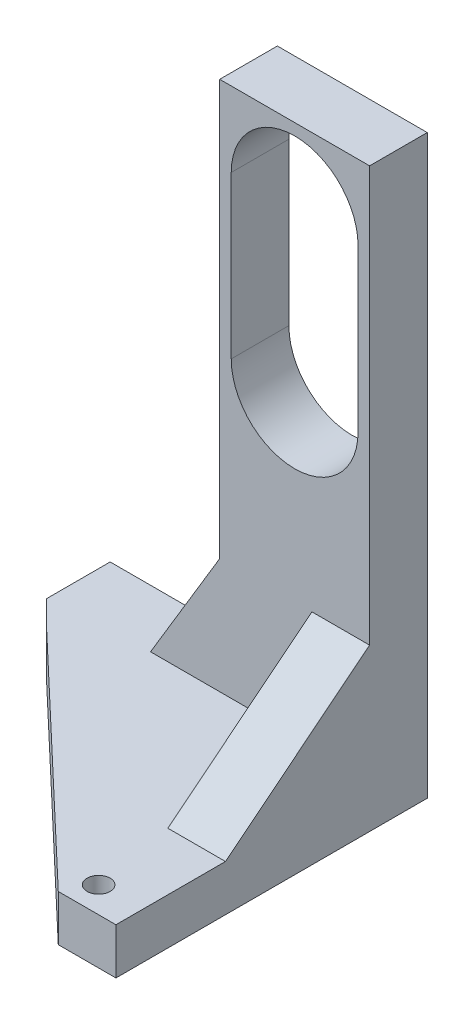
ISO-10303-21;
HEADER;
FILE_DESCRIPTION(('STEP AP214'),'2;1');
FILE_NAME('part.step','',(''),(''),'','','');
FILE_SCHEMA(('AUTOMOTIVE_DESIGN { 1 0 10303 214 1 1 1 1 }'));
ENDSEC;
DATA;
#1=APPLICATION_CONTEXT('core data for automotive mechanical design processes');
#2=APPLICATION_PROTOCOL_DEFINITION('international standard','automotive_design',2000,#1);
#3=PRODUCT_CONTEXT('',#1,'mechanical');
#4=PRODUCT('Part','Part','',(#3));
#5=PRODUCT_RELATED_PRODUCT_CATEGORY('part','',(#4));
#6=PRODUCT_DEFINITION_FORMATION('','',#4);
#7=PRODUCT_DEFINITION_CONTEXT('part definition',#1,'design');
#8=PRODUCT_DEFINITION('design','',#6,#7);
#9=PRODUCT_DEFINITION_SHAPE('','',#8);
#10=(LENGTH_UNIT() NAMED_UNIT(*) SI_UNIT(.MILLI.,.METRE.));
#11=(NAMED_UNIT(*) PLANE_ANGLE_UNIT() SI_UNIT($,.RADIAN.));
#12=(NAMED_UNIT(*) SI_UNIT($,.STERADIAN.) SOLID_ANGLE_UNIT());
#13=UNCERTAINTY_MEASURE_WITH_UNIT(LENGTH_MEASURE(1.E-05),#10,'distance_accuracy_value','');
#14=(GEOMETRIC_REPRESENTATION_CONTEXT(3) GLOBAL_UNCERTAINTY_ASSIGNED_CONTEXT((#13)) GLOBAL_UNIT_ASSIGNED_CONTEXT((#10,
#11,#12)) REPRESENTATION_CONTEXT('',''));
#15=CARTESIAN_POINT('',(0.,0.,0.));
#16=DIRECTION('',(0.,0.,1.));
#17=DIRECTION('',(1.,0.,0.));
#18=AXIS2_PLACEMENT_3D('',#15,#16,#17);
#19=CARTESIAN_POINT('',(0.,0.,10.));
#20=DIRECTION('',(0.,0.,-1.));
#21=DIRECTION('',(-1.,0.,0.));
#22=AXIS2_PLACEMENT_3D('',#19,#20,#21);
#23=PLANE('',#22);
#24=DIRECTION('',(0.,1.,0.));
#25=VECTOR('',#24,1.);
#26=CARTESIAN_POINT('',(3.00000000000022,-53.75,9.99999999999997));
#27=LINE('',#26,#25);
#28=CARTESIAN_POINT('',(3.00000000000022,-53.75,10.0000000000002));
#29=VERTEX_POINT('',#28);
#30=CARTESIAN_POINT('',(3.00000000000022,-33.75,10.));
#31=VERTEX_POINT('',#30);
#32=EDGE_CURVE('E196',#29,#31,#27,.T.);
#33=ORIENTED_EDGE('',*,*,#32,.T.);
#34=DIRECTION('',(1.,0.,0.));
#35=VECTOR('',#34,1.);
#36=CARTESIAN_POINT('',(3.00000000000022,-33.75,10.));
#37=LINE('',#36,#35);
#38=CARTESIAN_POINT('',(13.0000000000002,-33.7499999999999,10.));
#39=VERTEX_POINT('',#38);
#40=EDGE_CURVE('E203',#31,#39,#37,.T.);
#41=ORIENTED_EDGE('',*,*,#40,.T.);
#42=DIRECTION('',(0.,1.,0.));
#43=VECTOR('',#42,1.);
#44=CARTESIAN_POINT('',(13.0000000000002,-58.75,10.));
#45=LINE('',#44,#43);
#46=CARTESIAN_POINT('',(13.0000000000002,38.25,10.));
#47=VERTEX_POINT('',#46);
#48=EDGE_CURVE('E275',#39,#47,#45,.T.);
#49=ORIENTED_EDGE('',*,*,#48,.T.);
#50=DIRECTION('',(1.,0.,0.));
#51=VECTOR('',#50,1.);
#52=CARTESIAN_POINT('',(-13.0000000000001,38.25,10.));
#53=LINE('',#52,#51);
#54=CARTESIAN_POINT('',(-13.0000000000001,38.25,10.));
#55=VERTEX_POINT('',#54);
#56=EDGE_CURVE('E271',#55,#47,#53,.T.);
#57=ORIENTED_EDGE('',*,*,#56,.F.);
#58=DIRECTION('',(0.,1.,0.));
#59=VECTOR('',#58,1.);
#60=CARTESIAN_POINT('',(-12.9999999999998,-58.75,10.));
#61=LINE('',#60,#59);
#62=CARTESIAN_POINT('',(-12.9999999999999,-33.75,10.));
#63=VERTEX_POINT('',#62);
#64=EDGE_CURVE('E269',#63,#55,#61,.T.);
#65=ORIENTED_EDGE('',*,*,#64,.F.);
#66=DIRECTION('',(-0.514495755427524,-0.857492925712545,0.));
#67=VECTOR('',#66,1.);
#68=CARTESIAN_POINT('',(-13.0000000000002,-33.75,10.));
#69=LINE('',#68,#67);
#70=CARTESIAN_POINT('',(-25.0000000000001,-53.75,10.));
#71=VERTEX_POINT('',#70);
#72=EDGE_CURVE('E178',#63,#71,#69,.T.);
#73=ORIENTED_EDGE('',*,*,#72,.T.);
#74=DIRECTION('',(-1.,0.,0.));
#75=VECTOR('',#74,1.);
#76=CARTESIAN_POINT('',(13.0000000000002,-53.75,9.99999999999997));
#77=LINE('',#76,#75);
#78=EDGE_CURVE('E220',#29,#71,#77,.T.);
#79=ORIENTED_EDGE('',*,*,#78,.F.);
#80=EDGE_LOOP('',(#33,#41,#49,#57,#65,#73,#79));
#81=FACE_BOUND('',#80,.T.);
#82=CARTESIAN_POINT('',(0.,-2.75,10.));
#83=DIRECTION('',(0.,0.,1.));
#84=DIRECTION('',(1.,0.,0.));
#85=AXIS2_PLACEMENT_3D('',#82,#83,#84);
#86=CIRCLE('',#85,11.);
#87=CARTESIAN_POINT('',(-11.,-2.75,10.));
#88=VERTEX_POINT('',#87);
#89=CARTESIAN_POINT('',(11.,-2.75,10.));
#90=VERTEX_POINT('',#89);
#91=EDGE_CURVE('E239',#88,#90,#86,.T.);
#92=ORIENTED_EDGE('',*,*,#91,.F.);
#93=DIRECTION('',(0.,-1.,0.));
#94=VECTOR('',#93,1.);
#95=CARTESIAN_POINT('',(-11.,-2.75,10.));
#96=LINE('',#95,#94);
#97=CARTESIAN_POINT('',(-11.0000000000001,25.25,10.));
#98=VERTEX_POINT('',#97);
#99=EDGE_CURVE('E247',#98,#88,#96,.T.);
#100=ORIENTED_EDGE('',*,*,#99,.F.);
#101=CARTESIAN_POINT('',(0.,25.25,10.));
#102=DIRECTION('',(0.,0.,1.));
#103=DIRECTION('',(-1.,0.,0.));
#104=AXIS2_PLACEMENT_3D('',#101,#102,#103);
#105=CIRCLE('',#104,11.);
#106=CARTESIAN_POINT('',(11.,25.25,10.));
#107=VERTEX_POINT('',#106);
#108=EDGE_CURVE('E244',#107,#98,#105,.T.);
#109=ORIENTED_EDGE('',*,*,#108,.F.);
#110=DIRECTION('',(0.,1.,0.));
#111=VECTOR('',#110,1.);
#112=CARTESIAN_POINT('',(11.,-2.75,10.));
#113=LINE('',#112,#111);
#114=EDGE_CURVE('E241',#90,#107,#113,.T.);
#115=ORIENTED_EDGE('',*,*,#114,.F.);
#116=EDGE_LOOP('',(#92,#100,#109,#115));
#117=FACE_BOUND('',#116,.T.);
#118=ADVANCED_FACE('F43',(#81,#117),#23,.F.);
#119=CARTESIAN_POINT('',(0.,0.,0.));
#120=DIRECTION('',(0.,0.,-1.));
#121=DIRECTION('',(-1.,0.,0.));
#122=AXIS2_PLACEMENT_3D('',#119,#120,#121);
#123=PLANE('',#122);
#124=DIRECTION('',(-0.514495755427524,-0.857492925712545,0.));
#125=VECTOR('',#124,1.);
#126=CARTESIAN_POINT('',(-13.0000000000002,-33.75,0.));
#127=LINE('',#126,#125);
#128=CARTESIAN_POINT('',(-12.9999999999999,-33.75,0.));
#129=VERTEX_POINT('',#128);
#130=CARTESIAN_POINT('',(-25.0000000000001,-53.75,3.0184188481996E-13));
#131=VERTEX_POINT('',#130);
#132=EDGE_CURVE('E181',#129,#131,#127,.T.);
#133=ORIENTED_EDGE('',*,*,#132,.F.);
#134=DIRECTION('',(0.,1.,0.));
#135=VECTOR('',#134,1.);
#136=CARTESIAN_POINT('',(-12.9999999999998,-58.75,0.));
#137=LINE('',#136,#135);
#138=CARTESIAN_POINT('',(-13.0000000000001,38.25,0.));
#139=VERTEX_POINT('',#138);
#140=EDGE_CURVE('E58',#129,#139,#137,.T.);
#141=ORIENTED_EDGE('',*,*,#140,.T.);
#142=DIRECTION('',(1.,0.,0.));
#143=VECTOR('',#142,1.);
#144=CARTESIAN_POINT('',(-13.0000000000001,38.25,0.));
#145=LINE('',#144,#143);
#146=CARTESIAN_POINT('',(13.0000000000002,38.25,0.));
#147=VERTEX_POINT('',#146);
#148=EDGE_CURVE('E278',#139,#147,#145,.T.);
#149=ORIENTED_EDGE('',*,*,#148,.T.);
#150=DIRECTION('',(0.,1.,0.));
#151=VECTOR('',#150,1.);
#152=CARTESIAN_POINT('',(13.0000000000002,-58.75,0.));
#153=LINE('',#152,#151);
#154=CARTESIAN_POINT('',(13.0000000000002,-61.75,0.));
#155=VERTEX_POINT('',#154);
#156=EDGE_CURVE('E272',#155,#147,#153,.T.);
#157=ORIENTED_EDGE('',*,*,#156,.F.);
#158=DIRECTION('',(1.,0.,0.));
#159=VECTOR('',#158,1.);
#160=CARTESIAN_POINT('',(13.0000000000002,-61.75,0.));
#161=LINE('',#160,#159);
#162=CARTESIAN_POINT('',(-41.9999999999998,-61.75,0.));
#163=VERTEX_POINT('',#162);
#164=EDGE_CURVE('E225',#163,#155,#161,.T.);
#165=ORIENTED_EDGE('',*,*,#164,.F.);
#166=DIRECTION('',(0.,1.,0.));
#167=VECTOR('',#166,1.);
#168=CARTESIAN_POINT('',(-41.9999999999998,-61.75,0.));
#169=LINE('',#168,#167);
#170=CARTESIAN_POINT('',(-41.9999999999998,-53.75,0.));
#171=VERTEX_POINT('',#170);
#172=EDGE_CURVE('E162',#163,#171,#169,.T.);
#173=ORIENTED_EDGE('',*,*,#172,.T.);
#174=DIRECTION('',(-1.,0.,0.));
#175=VECTOR('',#174,1.);
#176=CARTESIAN_POINT('',(-13.0000000000001,-53.75,6.38378239159465E-13));
#177=LINE('',#176,#175);
#178=EDGE_CURVE('E209',#131,#171,#177,.T.);
#179=ORIENTED_EDGE('',*,*,#178,.F.);
#180=EDGE_LOOP('',(#133,#141,#149,#157,#165,#173,#179));
#181=FACE_BOUND('',#180,.T.);
#182=DIRECTION('',(0.,-1.,0.));
#183=VECTOR('',#182,1.);
#184=CARTESIAN_POINT('',(-11.,-2.75,0.));
#185=LINE('',#184,#183);
#186=CARTESIAN_POINT('',(-11.0000000000001,25.25,0.));
#187=VERTEX_POINT('',#186);
#188=CARTESIAN_POINT('',(-11.,-2.75,0.));
#189=VERTEX_POINT('',#188);
#190=EDGE_CURVE('E242',#187,#189,#185,.T.);
#191=ORIENTED_EDGE('',*,*,#190,.T.);
#192=CARTESIAN_POINT('',(0.,-2.75,0.));
#193=DIRECTION('',(0.,0.,1.));
#194=DIRECTION('',(1.,0.,0.));
#195=AXIS2_PLACEMENT_3D('',#192,#193,#194);
#196=CIRCLE('',#195,11.);
#197=CARTESIAN_POINT('',(11.,-2.75,0.));
#198=VERTEX_POINT('',#197);
#199=EDGE_CURVE('E238',#189,#198,#196,.T.);
#200=ORIENTED_EDGE('',*,*,#199,.T.);
#201=DIRECTION('',(0.,1.,0.));
#202=VECTOR('',#201,1.);
#203=CARTESIAN_POINT('',(11.,-2.75,0.));
#204=LINE('',#203,#202);
#205=CARTESIAN_POINT('',(11.,25.25,0.));
#206=VERTEX_POINT('',#205);
#207=EDGE_CURVE('E252',#198,#206,#204,.T.);
#208=ORIENTED_EDGE('',*,*,#207,.T.);
#209=CARTESIAN_POINT('',(0.,25.25,0.));
#210=DIRECTION('',(0.,0.,1.));
#211=DIRECTION('',(-1.,0.,0.));
#212=AXIS2_PLACEMENT_3D('',#209,#210,#211);
#213=CIRCLE('',#212,11.);
#214=EDGE_CURVE('E255',#206,#187,#213,.T.);
#215=ORIENTED_EDGE('',*,*,#214,.T.);
#216=EDGE_LOOP('',(#191,#200,#208,#215));
#217=FACE_BOUND('',#216,.T.);
#218=ADVANCED_FACE('F291',(#181,#217),#123,.T.);
#219=CARTESIAN_POINT('',(13.0000000000002,-58.75,10.));
#220=DIRECTION('',(-1.,0.,0.));
#221=DIRECTION('',(0.,0.,1.));
#222=AXIS2_PLACEMENT_3D('',#219,#220,#221);
#223=PLANE('',#222);
#224=ORIENTED_EDGE('',*,*,#48,.F.);
#225=DIRECTION('',(0.,-0.624695047554419,0.780868809443034));
#226=VECTOR('',#225,1.);
#227=CARTESIAN_POINT('',(13.0000000000002,-33.75,10.));
#228=LINE('',#227,#226);
#229=CARTESIAN_POINT('',(13.0000000000002,-53.7499999999998,35.));
#230=VERTEX_POINT('',#229);
#231=EDGE_CURVE('E195',#39,#230,#228,.T.);
#232=ORIENTED_EDGE('',*,*,#231,.T.);
#233=DIRECTION('',(0.,0.,-1.));
#234=VECTOR('',#233,1.);
#235=CARTESIAN_POINT('',(13.0000000000002,-53.7499999999997,54.));
#236=LINE('',#235,#234);
#237=CARTESIAN_POINT('',(13.0000000000002,-53.7499999999997,54.));
#238=VERTEX_POINT('',#237);
#239=EDGE_CURVE('E218',#238,#230,#236,.T.);
#240=ORIENTED_EDGE('',*,*,#239,.F.);
#241=DIRECTION('',(0.,1.,0.));
#242=VECTOR('',#241,1.);
#243=CARTESIAN_POINT('',(13.0000000000002,-61.7499999999997,54.));
#244=LINE('',#243,#242);
#245=CARTESIAN_POINT('',(13.0000000000002,-61.7499999999997,54.));
#246=VERTEX_POINT('',#245);
#247=EDGE_CURVE('E236',#246,#238,#244,.T.);
#248=ORIENTED_EDGE('',*,*,#247,.F.);
#249=DIRECTION('',(0.,0.,1.));
#250=VECTOR('',#249,1.);
#251=CARTESIAN_POINT('',(13.0000000000002,-61.75,0.));
#252=LINE('',#251,#250);
#253=EDGE_CURVE('E227',#155,#246,#252,.T.);
#254=ORIENTED_EDGE('',*,*,#253,.F.);
#255=ORIENTED_EDGE('',*,*,#156,.T.);
#256=DIRECTION('',(0.,0.,-1.));
#257=VECTOR('',#256,1.);
#258=CARTESIAN_POINT('',(13.0000000000002,38.25,10.));
#259=LINE('',#258,#257);
#260=EDGE_CURVE('E11',#47,#147,#259,.T.);
#261=ORIENTED_EDGE('',*,*,#260,.F.);
#262=EDGE_LOOP('',(#224,#232,#240,#248,#254,#255,#261));
#263=FACE_BOUND('',#262,.T.);
#264=ADVANCED_FACE('F286',(#263),#223,.F.);
#265=CARTESIAN_POINT('',(-13.0000000000001,38.25,10.));
#266=DIRECTION('',(0.,1.,0.));
#267=DIRECTION('',(0.,0.,1.));
#268=AXIS2_PLACEMENT_3D('',#265,#266,#267);
#269=PLANE('',#268);
#270=ORIENTED_EDGE('',*,*,#148,.F.);
#271=DIRECTION('',(0.,0.,-1.));
#272=VECTOR('',#271,1.);
#273=CARTESIAN_POINT('',(-13.0000000000001,38.25,10.));
#274=LINE('',#273,#272);
#275=EDGE_CURVE('E47',#55,#139,#274,.T.);
#276=ORIENTED_EDGE('',*,*,#275,.F.);
#277=ORIENTED_EDGE('',*,*,#56,.T.);
#278=ORIENTED_EDGE('',*,*,#260,.T.);
#279=EDGE_LOOP('',(#270,#276,#277,#278));
#280=FACE_BOUND('',#279,.T.);
#281=ADVANCED_FACE('F295',(#280),#269,.T.);
#282=CARTESIAN_POINT('',(-12.9999999999998,-58.75,10.));
#283=DIRECTION('',(-1.,0.,0.));
#284=DIRECTION('',(0.,-1.,0.));
#285=AXIS2_PLACEMENT_3D('',#282,#283,#284);
#286=PLANE('',#285);
#287=DIRECTION('',(0.,0.,1.));
#288=VECTOR('',#287,1.);
#289=CARTESIAN_POINT('',(-13.0000000000002,-33.75,0.));
#290=LINE('',#289,#288);
#291=EDGE_CURVE('E62',#129,#63,#290,.T.);
#292=ORIENTED_EDGE('',*,*,#291,.T.);
#293=ORIENTED_EDGE('',*,*,#64,.T.);
#294=ORIENTED_EDGE('',*,*,#275,.T.);
#295=ORIENTED_EDGE('',*,*,#140,.F.);
#296=EDGE_LOOP('',(#292,#293,#294,#295));
#297=FACE_BOUND('',#296,.T.);
#298=ADVANCED_FACE('F45',(#297),#286,.T.);
#299=CARTESIAN_POINT('',(0.,-2.75,10.));
#300=DIRECTION('',(0.,0.,-1.));
#301=DIRECTION('',(-1.,0.,0.));
#302=AXIS2_PLACEMENT_3D('',#299,#300,#301);
#303=CYLINDRICAL_SURFACE('',#302,11.);
#304=ORIENTED_EDGE('',*,*,#199,.F.);
#305=DIRECTION('',(0.,0.,-1.));
#306=VECTOR('',#305,1.);
#307=CARTESIAN_POINT('',(-11.,-2.75,10.));
#308=LINE('',#307,#306);
#309=EDGE_CURVE('E249',#88,#189,#308,.T.);
#310=ORIENTED_EDGE('',*,*,#309,.F.);
#311=ORIENTED_EDGE('',*,*,#91,.T.);
#312=DIRECTION('',(0.,0.,-1.));
#313=VECTOR('',#312,1.);
#314=CARTESIAN_POINT('',(11.,-2.75,10.));
#315=LINE('',#314,#313);
#316=EDGE_CURVE('E266',#90,#198,#315,.T.);
#317=ORIENTED_EDGE('',*,*,#316,.T.);
#318=EDGE_LOOP('',(#304,#310,#311,#317));
#319=FACE_BOUND('',#318,.T.);
#320=ADVANCED_FACE('F340',(#319),#303,.F.);
#321=CARTESIAN_POINT('',(11.,-2.75,10.));
#322=DIRECTION('',(-1.,0.,0.));
#323=DIRECTION('',(0.,-1.,0.));
#324=AXIS2_PLACEMENT_3D('',#321,#322,#323);
#325=PLANE('',#324);
#326=ORIENTED_EDGE('',*,*,#207,.F.);
#327=ORIENTED_EDGE('',*,*,#316,.F.);
#328=ORIENTED_EDGE('',*,*,#114,.T.);
#329=DIRECTION('',(0.,0.,-1.));
#330=VECTOR('',#329,1.);
#331=CARTESIAN_POINT('',(11.,25.25,10.));
#332=LINE('',#331,#330);
#333=EDGE_CURVE('E264',#107,#206,#332,.T.);
#334=ORIENTED_EDGE('',*,*,#333,.T.);
#335=EDGE_LOOP('',(#326,#327,#328,#334));
#336=FACE_BOUND('',#335,.T.);
#337=ADVANCED_FACE('F350',(#336),#325,.T.);
#338=CARTESIAN_POINT('',(0.,25.25,10.));
#339=DIRECTION('',(0.,0.,-1.));
#340=DIRECTION('',(-1.,0.,0.));
#341=AXIS2_PLACEMENT_3D('',#338,#339,#340);
#342=CYLINDRICAL_SURFACE('',#341,11.);
#343=ORIENTED_EDGE('',*,*,#214,.F.);
#344=ORIENTED_EDGE('',*,*,#333,.F.);
#345=ORIENTED_EDGE('',*,*,#108,.T.);
#346=DIRECTION('',(0.,0.,-1.));
#347=VECTOR('',#346,1.);
#348=CARTESIAN_POINT('',(-11.0000000000001,25.25,10.));
#349=LINE('',#348,#347);
#350=EDGE_CURVE('E262',#98,#187,#349,.T.);
#351=ORIENTED_EDGE('',*,*,#350,.T.);
#352=EDGE_LOOP('',(#343,#344,#345,#351));
#353=FACE_BOUND('',#352,.T.);
#354=ADVANCED_FACE('F355',(#353),#342,.F.);
#355=CARTESIAN_POINT('',(-11.,-2.75,10.));
#356=DIRECTION('',(1.,0.,0.));
#357=DIRECTION('',(0.,1.,0.));
#358=AXIS2_PLACEMENT_3D('',#355,#356,#357);
#359=PLANE('',#358);
#360=ORIENTED_EDGE('',*,*,#190,.F.);
#361=ORIENTED_EDGE('',*,*,#350,.F.);
#362=ORIENTED_EDGE('',*,*,#99,.T.);
#363=ORIENTED_EDGE('',*,*,#309,.T.);
#364=EDGE_LOOP('',(#360,#361,#362,#363));
#365=FACE_BOUND('',#364,.T.);
#366=ADVANCED_FACE('F362',(#365),#359,.T.);
#367=CARTESIAN_POINT('',(13.0000000000002,-61.7499999999997,54.));
#368=DIRECTION('',(0.,0.,-1.));
#369=DIRECTION('',(0.,1.,0.));
#370=AXIS2_PLACEMENT_3D('',#367,#368,#369);
#371=PLANE('',#370);
#372=ORIENTED_EDGE('',*,*,#247,.T.);
#373=DIRECTION('',(1.,0.,0.));
#374=VECTOR('',#373,1.);
#375=CARTESIAN_POINT('',(3.00000000000022,-53.7499999999997,54.));
#376=LINE('',#375,#374);
#377=CARTESIAN_POINT('',(3.00000000000022,-53.7499999999997,54.));
#378=VERTEX_POINT('',#377);
#379=EDGE_CURVE('E215',#378,#238,#376,.T.);
#380=ORIENTED_EDGE('',*,*,#379,.F.);
#381=DIRECTION('',(0.,1.,0.));
#382=VECTOR('',#381,1.);
#383=CARTESIAN_POINT('',(3.00000000000022,-61.7499999999997,54.));
#384=LINE('',#383,#382);
#385=CARTESIAN_POINT('',(3.00000000000022,-61.7499999999997,54.));
#386=VERTEX_POINT('',#385);
#387=EDGE_CURVE('E234',#386,#378,#384,.T.);
#388=ORIENTED_EDGE('',*,*,#387,.F.);
#389=DIRECTION('',(-1.,0.,0.));
#390=VECTOR('',#389,1.);
#391=CARTESIAN_POINT('',(13.0000000000002,-61.7499999999997,54.));
#392=LINE('',#391,#390);
#393=EDGE_CURVE('E229',#246,#386,#392,.T.);
#394=ORIENTED_EDGE('',*,*,#393,.F.);
#395=EDGE_LOOP('',(#372,#380,#388,#394));
#396=FACE_BOUND('',#395,.T.);
#397=ADVANCED_FACE('F315',(#396),#371,.F.);
#398=CARTESIAN_POINT('',(-36.9999999999998,-61.7499999999999,16.));
#399=DIRECTION('',(0.688749461914692,0.,-0.724999433594414));
#400=DIRECTION('',(-0.724999433594414,0.,-0.688749461914693));
#401=AXIS2_PLACEMENT_3D('',#398,#399,#400);
#402=PLANE('',#401);
#403=ORIENTED_EDGE('',*,*,#387,.T.);
#404=DIRECTION('',(0.724999433594414,0.,0.688749461914693));
#405=VECTOR('',#404,1.);
#406=CARTESIAN_POINT('',(-36.9999999999998,-53.7499999999999,16.));
#407=LINE('',#406,#405);
#408=CARTESIAN_POINT('',(-36.9999999999998,-53.7499999999999,16.));
#409=VERTEX_POINT('',#408);
#410=EDGE_CURVE('E212',#409,#378,#407,.T.);
#411=ORIENTED_EDGE('',*,*,#410,.F.);
#412=DIRECTION('',(0.,1.,0.));
#413=VECTOR('',#412,1.);
#414=CARTESIAN_POINT('',(-36.9999999999998,-61.7499999999999,16.));
#415=LINE('',#414,#413);
#416=CARTESIAN_POINT('',(-36.9999999999998,-61.7499999999999,16.));
#417=VERTEX_POINT('',#416);
#418=EDGE_CURVE('E232',#417,#409,#415,.T.);
#419=ORIENTED_EDGE('',*,*,#418,.F.);
#420=DIRECTION('',(-0.724999433594414,0.,-0.688749461914693));
#421=VECTOR('',#420,1.);
#422=CARTESIAN_POINT('',(-36.9999999999998,-61.7499999999999,16.));
#423=LINE('',#422,#421);
#424=EDGE_CURVE('E170',#386,#417,#423,.T.);
#425=ORIENTED_EDGE('',*,*,#424,.F.);
#426=EDGE_LOOP('',(#403,#411,#419,#425));
#427=FACE_BOUND('',#426,.T.);
#428=ADVANCED_FACE('F378',(#427),#402,.F.);
#429=CARTESIAN_POINT('',(0.,-61.75,4.28792601907481E-13));
#430=DIRECTION('',(0.,1.,0.));
#431=DIRECTION('',(0.,0.,1.));
#432=AXIS2_PLACEMENT_3D('',#429,#430,#431);
#433=PLANE('',#432);
#434=CARTESIAN_POINT('',(5.50000000000005,-61.7499999999995,49.5));
#435=DIRECTION('',(0.,-1.,0.));
#436=DIRECTION('',(0.,0.,-1.));
#437=AXIS2_PLACEMENT_3D('',#434,#435,#436);
#438=CIRCLE('',#437,2.);
#439=CARTESIAN_POINT('',(5.50000000000005,-61.7499999999995,47.5));
#440=VERTEX_POINT('',#439);
#441=EDGE_CURVE('E222',#440,#440,#438,.T.);
#442=ORIENTED_EDGE('',*,*,#441,.F.);
#443=EDGE_LOOP('',(#442));
#444=FACE_BOUND('',#443,.T.);
#445=ORIENTED_EDGE('',*,*,#164,.T.);
#446=ORIENTED_EDGE('',*,*,#253,.T.);
#447=ORIENTED_EDGE('',*,*,#393,.T.);
#448=ORIENTED_EDGE('',*,*,#424,.T.);
#449=DIRECTION('',(-0.707106781186557,0.,-0.707106781186539));
#450=VECTOR('',#449,1.);
#451=CARTESIAN_POINT('',(-36.9999999999998,-61.7499999999999,16.));
#452=LINE('',#451,#450);
#453=CARTESIAN_POINT('',(-41.9999999999998,-61.75,11.0000000000002));
#454=VERTEX_POINT('',#453);
#455=EDGE_CURVE('E165',#417,#454,#452,.T.);
#456=ORIENTED_EDGE('',*,*,#455,.T.);
#457=DIRECTION('',(0.,0.,-1.));
#458=VECTOR('',#457,1.);
#459=CARTESIAN_POINT('',(-41.9999999999998,-61.75,11.0000000000002));
#460=LINE('',#459,#458);
#461=EDGE_CURVE('E154',#454,#163,#460,.T.);
#462=ORIENTED_EDGE('',*,*,#461,.T.);
#463=EDGE_LOOP('',(#445,#446,#447,#448,#456,#462));
#464=FACE_BOUND('',#463,.T.);
#465=ADVANCED_FACE('F168',(#444,#464),#433,.F.);
#466=CARTESIAN_POINT('',(5.50000000000005,38.2500000000007,49.4999999999986));
#467=DIRECTION('',(0.,-1.,0.));
#468=DIRECTION('',(0.,0.,-1.));
#469=AXIS2_PLACEMENT_3D('',#466,#467,#468);
#470=CYLINDRICAL_SURFACE('',#469,2.);
#471=ORIENTED_EDGE('',*,*,#441,.T.);
#472=EDGE_LOOP('',(#471));
#473=FACE_BOUND('',#472,.T.);
#474=CARTESIAN_POINT('',(5.50000000000022,-53.7499999999997,49.5));
#475=DIRECTION('',(0.,1.,0.));
#476=DIRECTION('',(0.,0.,1.));
#477=AXIS2_PLACEMENT_3D('',#474,#475,#476);
#478=CIRCLE('',#477,2.);
#479=CARTESIAN_POINT('',(5.50000000000022,-53.7499999999997,51.5));
#480=VERTEX_POINT('',#479);
#481=EDGE_CURVE('E191',#480,#480,#478,.T.);
#482=ORIENTED_EDGE('',*,*,#481,.T.);
#483=EDGE_LOOP('',(#482));
#484=FACE_BOUND('',#483,.T.);
#485=ADVANCED_FACE('F384',(#473,#484),#470,.F.);
#486=CARTESIAN_POINT('',(0.,-53.75,3.72965547335014E-13));
#487=DIRECTION('',(0.,1.,0.));
#488=DIRECTION('',(0.,0.,1.));
#489=AXIS2_PLACEMENT_3D('',#486,#487,#488);
#490=PLANE('',#489);
#491=DIRECTION('',(0.,0.,1.));
#492=VECTOR('',#491,1.);
#493=CARTESIAN_POINT('',(-25.0000000000001,-53.75,0.));
#494=LINE('',#493,#492);
#495=EDGE_CURVE('E188',#131,#71,#494,.T.);
#496=ORIENTED_EDGE('',*,*,#495,.F.);
#497=ORIENTED_EDGE('',*,*,#178,.T.);
#498=DIRECTION('',(0.,0.,-1.));
#499=VECTOR('',#498,1.);
#500=CARTESIAN_POINT('',(-41.9999999999998,-53.75,11.0000000000002));
#501=LINE('',#500,#499);
#502=CARTESIAN_POINT('',(-41.9999999999998,-53.75,11.0000000000002));
#503=VERTEX_POINT('',#502);
#504=EDGE_CURVE('E173',#503,#171,#501,.T.);
#505=ORIENTED_EDGE('',*,*,#504,.F.);
#506=DIRECTION('',(-0.707106781186557,0.,-0.707106781186539));
#507=VECTOR('',#506,1.);
#508=CARTESIAN_POINT('',(-36.9999999999998,-53.7499999999999,16.));
#509=LINE('',#508,#507);
#510=EDGE_CURVE('E177',#409,#503,#509,.T.);
#511=ORIENTED_EDGE('',*,*,#510,.F.);
#512=ORIENTED_EDGE('',*,*,#410,.T.);
#513=ORIENTED_EDGE('',*,*,#379,.T.);
#514=ORIENTED_EDGE('',*,*,#239,.T.);
#515=DIRECTION('',(1.,0.,0.));
#516=VECTOR('',#515,1.);
#517=CARTESIAN_POINT('',(3.00000000000022,-53.7499999999997,35.));
#518=LINE('',#517,#516);
#519=CARTESIAN_POINT('',(3.00000000000022,-53.7499999999998,35.));
#520=VERTEX_POINT('',#519);
#521=EDGE_CURVE('E206',#520,#230,#518,.T.);
#522=ORIENTED_EDGE('',*,*,#521,.F.);
#523=DIRECTION('',(0.,0.,-1.));
#524=VECTOR('',#523,1.);
#525=CARTESIAN_POINT('',(3.00000000000022,-53.75,9.99999999999997));
#526=LINE('',#525,#524);
#527=EDGE_CURVE('E201',#520,#29,#526,.T.);
#528=ORIENTED_EDGE('',*,*,#527,.T.);
#529=ORIENTED_EDGE('',*,*,#78,.T.);
#530=EDGE_LOOP('',(#496,#497,#505,#511,#512,#513,#514,#522,#528,#529));
#531=FACE_BOUND('',#530,.T.);
#532=ORIENTED_EDGE('',*,*,#481,.F.);
#533=EDGE_LOOP('',(#532));
#534=FACE_BOUND('',#533,.T.);
#535=ADVANCED_FACE('F308',(#531,#534),#490,.T.);
#536=CARTESIAN_POINT('',(3.00000000000022,-33.75,10.));
#537=DIRECTION('',(0.,0.780868809443034,0.624695047554419));
#538=DIRECTION('',(0.,-0.62469504755442,0.780868809443034));
#539=AXIS2_PLACEMENT_3D('',#536,#537,#538);
#540=PLANE('',#539);
#541=ORIENTED_EDGE('',*,*,#231,.F.);
#542=ORIENTED_EDGE('',*,*,#40,.F.);
#543=DIRECTION('',(0.,-0.624695047554419,0.780868809443034));
#544=VECTOR('',#543,1.);
#545=CARTESIAN_POINT('',(3.00000000000022,-33.75,10.));
#546=LINE('',#545,#544);
#547=EDGE_CURVE('E198',#31,#520,#546,.T.);
#548=ORIENTED_EDGE('',*,*,#547,.T.);
#549=ORIENTED_EDGE('',*,*,#521,.T.);
#550=EDGE_LOOP('',(#541,#542,#548,#549));
#551=FACE_BOUND('',#550,.T.);
#552=ADVANCED_FACE('F304',(#551),#540,.T.);
#553=CARTESIAN_POINT('',(3.00000000000022,0.,0.));
#554=DIRECTION('',(1.,0.,0.));
#555=DIRECTION('',(0.,0.,-1.));
#556=AXIS2_PLACEMENT_3D('',#553,#554,#555);
#557=PLANE('',#556);
#558=ORIENTED_EDGE('',*,*,#32,.F.);
#559=ORIENTED_EDGE('',*,*,#527,.F.);
#560=ORIENTED_EDGE('',*,*,#547,.F.);
#561=EDGE_LOOP('',(#558,#559,#560));
#562=FACE_BOUND('',#561,.T.);
#563=ADVANCED_FACE('F323',(#562),#557,.F.);
#564=CARTESIAN_POINT('',(-13.0000000000002,-33.75,0.));
#565=DIRECTION('',(-0.857492925712545,0.514495755427524,0.));
#566=DIRECTION('',(-0.514495755427524,-0.857492925712545,0.));
#567=AXIS2_PLACEMENT_3D('',#564,#565,#566);
#568=PLANE('',#567);
#569=ORIENTED_EDGE('',*,*,#72,.F.);
#570=ORIENTED_EDGE('',*,*,#291,.F.);
#571=ORIENTED_EDGE('',*,*,#132,.T.);
#572=ORIENTED_EDGE('',*,*,#495,.T.);
#573=EDGE_LOOP('',(#569,#570,#571,#572));
#574=FACE_BOUND('',#573,.T.);
#575=ADVANCED_FACE('F320',(#574),#568,.T.);
#576=CARTESIAN_POINT('',(-36.9999999999998,-61.7499999999999,16.));
#577=DIRECTION('',(0.707106781186539,0.,-0.707106781186557));
#578=DIRECTION('',(-0.707106781186557,0.,-0.707106781186539));
#579=AXIS2_PLACEMENT_3D('',#576,#577,#578);
#580=PLANE('',#579);
#581=ORIENTED_EDGE('',*,*,#510,.T.);
#582=DIRECTION('',(0.,1.,0.));
#583=VECTOR('',#582,1.);
#584=CARTESIAN_POINT('',(-41.9999999999998,-61.75,11.0000000000002));
#585=LINE('',#584,#583);
#586=EDGE_CURVE('E159',#454,#503,#585,.T.);
#587=ORIENTED_EDGE('',*,*,#586,.F.);
#588=ORIENTED_EDGE('',*,*,#455,.F.);
#589=ORIENTED_EDGE('',*,*,#418,.T.);
#590=EDGE_LOOP('',(#581,#587,#588,#589));
#591=FACE_BOUND('',#590,.T.);
#592=ADVANCED_FACE('F175',(#591),#580,.F.);
#593=CARTESIAN_POINT('',(-41.9999999999998,-61.75,11.0000000000002));
#594=DIRECTION('',(1.,0.,0.));
#595=DIRECTION('',(0.,1.,0.));
#596=AXIS2_PLACEMENT_3D('',#593,#594,#595);
#597=PLANE('',#596);
#598=ORIENTED_EDGE('',*,*,#504,.T.);
#599=ORIENTED_EDGE('',*,*,#172,.F.);
#600=ORIENTED_EDGE('',*,*,#461,.F.);
#601=ORIENTED_EDGE('',*,*,#586,.T.);
#602=EDGE_LOOP('',(#598,#599,#600,#601));
#603=FACE_BOUND('',#602,.T.);
#604=ADVANCED_FACE('F157',(#603),#597,.F.);
#605=CLOSED_SHELL('',(#118,#218,#264,#281,#298,#320,#337,#354,#366,#397,#428,#465,#485,#535,
#552,#563,#575,#592,#604));
#606=MANIFOLD_SOLID_BREP('B2',#605);
#607=ADVANCED_BREP_SHAPE_REPRESENTATION('',(#18,#606),#14);
#608=SHAPE_DEFINITION_REPRESENTATION(#9,#607);
ENDSEC;
END-ISO-10303-21;
